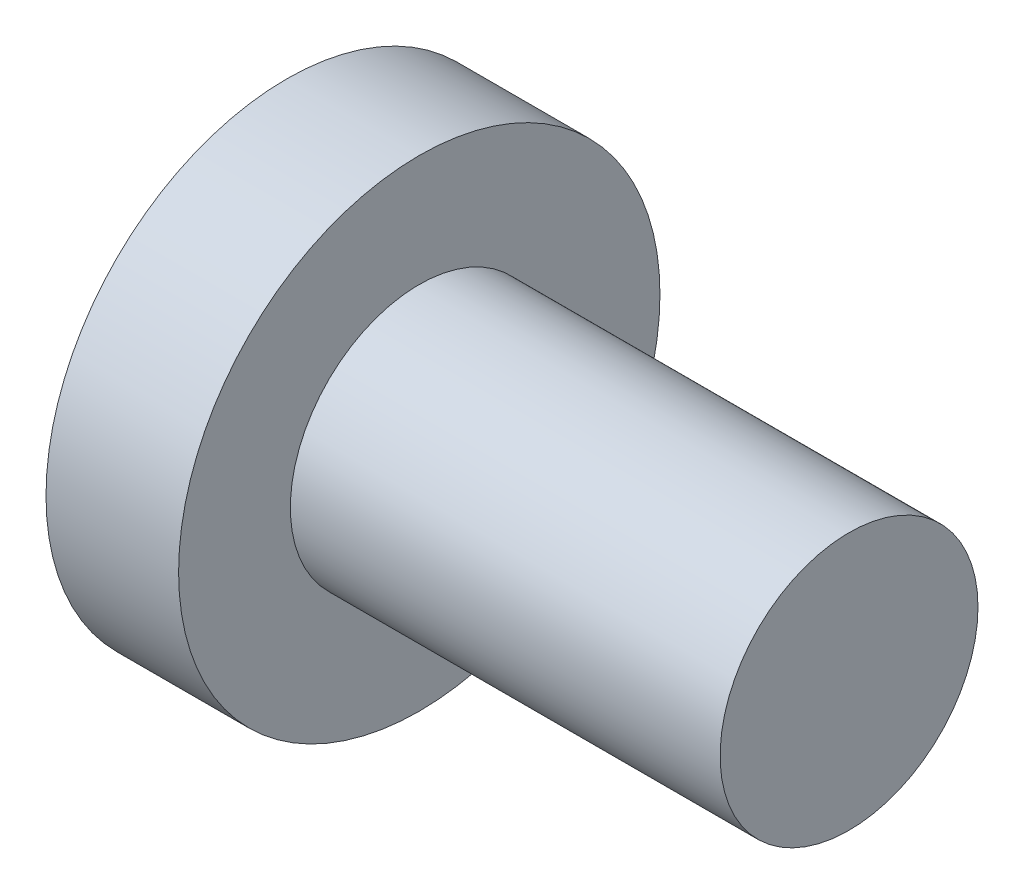
ISO-10303-21;
HEADER;
FILE_DESCRIPTION(('STEP AP214'),'2;1');
FILE_NAME('part.step','',(''),(''),'','','');
FILE_SCHEMA(('AUTOMOTIVE_DESIGN { 1 0 10303 214 1 1 1 1 }'));
ENDSEC;
DATA;
#1=APPLICATION_CONTEXT('core data for automotive mechanical design processes');
#2=APPLICATION_PROTOCOL_DEFINITION('international standard','automotive_design',2000,#1);
#3=PRODUCT_CONTEXT('',#1,'mechanical');
#4=PRODUCT('Part','Part','',(#3));
#5=PRODUCT_RELATED_PRODUCT_CATEGORY('part','',(#4));
#6=PRODUCT_DEFINITION_FORMATION('','',#4);
#7=PRODUCT_DEFINITION_CONTEXT('part definition',#1,'design');
#8=PRODUCT_DEFINITION('design','',#6,#7);
#9=PRODUCT_DEFINITION_SHAPE('','',#8);
#10=(LENGTH_UNIT() NAMED_UNIT(*) SI_UNIT(.MILLI.,.METRE.));
#11=(NAMED_UNIT(*) PLANE_ANGLE_UNIT() SI_UNIT($,.RADIAN.));
#12=(NAMED_UNIT(*) SI_UNIT($,.STERADIAN.) SOLID_ANGLE_UNIT());
#13=UNCERTAINTY_MEASURE_WITH_UNIT(LENGTH_MEASURE(1.E-05),#10,'distance_accuracy_value','');
#14=(GEOMETRIC_REPRESENTATION_CONTEXT(3) GLOBAL_UNCERTAINTY_ASSIGNED_CONTEXT((#13)) GLOBAL_UNIT_ASSIGNED_CONTEXT((#10,
#11,#12)) REPRESENTATION_CONTEXT('',''));
#15=CARTESIAN_POINT('',(0.,0.,0.));
#16=DIRECTION('',(0.,0.,1.));
#17=DIRECTION('',(1.,0.,0.));
#18=AXIS2_PLACEMENT_3D('',#15,#16,#17);
#19=CARTESIAN_POINT('',(1.68,0.3,0.3));
#20=DIRECTION('',(1.,0.,0.));
#21=DIRECTION('',(0.,0.,-1.));
#22=AXIS2_PLACEMENT_3D('',#19,#20,#21);
#23=PLANE('',#22);
#24=CARTESIAN_POINT('',(1.68,0.6,0.6));
#25=DIRECTION('',(-1.,0.,0.));
#26=DIRECTION('',(0.,0.,1.));
#27=AXIS2_PLACEMENT_3D('',#24,#25,#26);
#28=CIRCLE('',#27,0.3);
#29=CARTESIAN_POINT('',(1.68,0.530051547761426,0.308268592658542));
#30=VERTEX_POINT('',#29);
#31=CARTESIAN_POINT('',(1.68,0.308268592658542,0.530051547761425));
#32=VERTEX_POINT('',#31);
#33=EDGE_CURVE('E19',#30,#32,#28,.T.);
#34=ORIENTED_EDGE('',*,*,#33,.F.);
#35=DIRECTION('',(0.,0.,1.));
#36=VECTOR('',#35,1.);
#37=CARTESIAN_POINT('',(1.68,0.530051547761426,0.));
#38=LINE('',#37,#36);
#39=CARTESIAN_POINT('',(1.68,0.530051547761426,-0.308268592658542));
#40=VERTEX_POINT('',#39);
#41=EDGE_CURVE('E129',#40,#30,#38,.T.);
#42=ORIENTED_EDGE('',*,*,#41,.F.);
#43=CARTESIAN_POINT('',(1.68,0.6,-0.6));
#44=DIRECTION('',(-1.,0.,0.));
#45=DIRECTION('',(0.,0.,1.));
#46=AXIS2_PLACEMENT_3D('',#43,#44,#45);
#47=CIRCLE('',#46,0.3);
#48=CARTESIAN_POINT('',(1.68,0.308268592658542,-0.530051547761426));
#49=VERTEX_POINT('',#48);
#50=EDGE_CURVE('E270',#49,#40,#47,.T.);
#51=ORIENTED_EDGE('',*,*,#50,.F.);
#52=DIRECTION('',(0.,1.,0.));
#53=VECTOR('',#52,1.);
#54=CARTESIAN_POINT('',(1.68,0.,-0.530051547761426));
#55=LINE('',#54,#53);
#56=CARTESIAN_POINT('',(1.68,-0.308268592658542,-0.530051547761426));
#57=VERTEX_POINT('',#56);
#58=EDGE_CURVE('E152',#57,#49,#55,.T.);
#59=ORIENTED_EDGE('',*,*,#58,.F.);
#60=CARTESIAN_POINT('',(1.68,-0.6,-0.6));
#61=DIRECTION('',(-1.,0.,0.));
#62=DIRECTION('',(0.,0.,1.));
#63=AXIS2_PLACEMENT_3D('',#60,#61,#62);
#64=CIRCLE('',#63,0.3);
#65=CARTESIAN_POINT('',(1.68,-0.530051547761426,-0.308268592658542));
#66=VERTEX_POINT('',#65);
#67=EDGE_CURVE('E288',#66,#57,#64,.T.);
#68=ORIENTED_EDGE('',*,*,#67,.F.);
#69=DIRECTION('',(0.,0.,1.));
#70=VECTOR('',#69,1.);
#71=CARTESIAN_POINT('',(1.68,-0.530051547761426,0.));
#72=LINE('',#71,#70);
#73=CARTESIAN_POINT('',(1.68,-0.530051547761426,0.308268592658541));
#74=VERTEX_POINT('',#73);
#75=EDGE_CURVE('E157',#74,#66,#72,.F.);
#76=ORIENTED_EDGE('',*,*,#75,.F.);
#77=CARTESIAN_POINT('',(1.68,-0.6,0.6));
#78=DIRECTION('',(-1.,0.,0.));
#79=DIRECTION('',(0.,0.,1.));
#80=AXIS2_PLACEMENT_3D('',#77,#78,#79);
#81=CIRCLE('',#80,0.3);
#82=CARTESIAN_POINT('',(1.68,-0.308268592658542,0.530051547761425));
#83=VERTEX_POINT('',#82);
#84=EDGE_CURVE('E319',#83,#74,#81,.T.);
#85=ORIENTED_EDGE('',*,*,#84,.F.);
#86=DIRECTION('',(0.,1.,0.));
#87=VECTOR('',#86,1.);
#88=CARTESIAN_POINT('',(1.68,0.,0.530051547761425));
#89=LINE('',#88,#87);
#90=EDGE_CURVE('E132',#32,#83,#89,.F.);
#91=ORIENTED_EDGE('',*,*,#90,.F.);
#92=EDGE_LOOP('',(#34,#42,#51,#59,#68,#76,#85,#91));
#93=FACE_BOUND('',#92,.T.);
#94=ADVANCED_FACE('F16',(#93),#23,.F.);
#95=CARTESIAN_POINT('',(1.68,0.6,0.6));
#96=DIRECTION('',(-1.,0.,0.));
#97=DIRECTION('',(0.,0.,1.));
#98=AXIS2_PLACEMENT_3D('',#95,#96,#97);
#99=CYLINDRICAL_SURFACE('',#98,0.3);
#100=DIRECTION('',(1.,0.,0.));
#101=VECTOR('',#100,1.);
#102=CARTESIAN_POINT('',(1.68,0.6,0.3));
#103=LINE('',#102,#101);
#104=CARTESIAN_POINT('',(1.55884572681199,0.6,0.3));
#105=VERTEX_POINT('',#104);
#106=CARTESIAN_POINT('',(0.0452043432650023,0.6,0.3));
#107=VERTEX_POINT('',#106);
#108=EDGE_CURVE('E140',#105,#107,#103,.F.);
#109=ORIENTED_EDGE('',*,*,#108,.F.);
#110=CARTESIAN_POINT('',(1.55884572681199,0.6,0.6));
#111=DIRECTION('',(-0.500000000000001,-0.866025403784438,0.));
#112=DIRECTION('',(-0.866025403784438,0.500000000000001,0.));
#113=AXIS2_PLACEMENT_3D('',#110,#111,#112);
#114=ELLIPSE('',#113,0.599999999999999,0.3);
#115=EDGE_CURVE('E137',#30,#105,#114,.F.);
#116=ORIENTED_EDGE('',*,*,#115,.F.);
#117=ORIENTED_EDGE('',*,*,#33,.T.);
#118=CARTESIAN_POINT('',(1.55884572681198,0.6,0.6));
#119=DIRECTION('',(-0.500000000000001,0.,-0.866025403784438));
#120=DIRECTION('',(-0.866025403784438,0.,0.500000000000001));
#121=AXIS2_PLACEMENT_3D('',#118,#119,#120);
#122=ELLIPSE('',#121,0.599999999999999,0.3);
#123=CARTESIAN_POINT('',(1.55884572681198,0.3,0.6));
#124=VERTEX_POINT('',#123);
#125=EDGE_CURVE('E163',#124,#32,#122,.F.);
#126=ORIENTED_EDGE('',*,*,#125,.F.);
#127=DIRECTION('',(1.,0.,0.));
#128=VECTOR('',#127,1.);
#129=CARTESIAN_POINT('',(1.68,0.3,0.6));
#130=LINE('',#129,#128);
#131=CARTESIAN_POINT('',(0.0452043432650022,0.3,0.6));
#132=VERTEX_POINT('',#131);
#133=EDGE_CURVE('E342',#132,#124,#130,.T.);
#134=ORIENTED_EDGE('',*,*,#133,.F.);
#135=CARTESIAN_POINT('',(0.045204343265002,0.3,0.6));
#136=CARTESIAN_POINT('',(0.0431803773547012,0.299985307394552,0.583300670242799));
#137=CARTESIAN_POINT('',(0.041327518972927,0.301393620932924,0.566581321954255));
#138=CARTESIAN_POINT('',(0.0380100167582494,0.306971691490191,0.533576811460895));
#139=CARTESIAN_POINT('',(0.0365452234518665,0.311140383105357,0.517291484261665));
#140=CARTESIAN_POINT('',(0.0340472246762041,0.322159147202066,0.485603014109345));
#141=CARTESIAN_POINT('',(0.0330143640419723,0.329011353659084,0.470200584453282));
#142=CARTESIAN_POINT('',(0.0314127308771856,0.345205677002303,0.440745321476264));
#143=CARTESIAN_POINT('',(0.0308438058524891,0.354546974391774,0.42669204603377));
#144=CARTESIAN_POINT('',(0.030189505257813,0.375376386086933,0.400443408955856));
#145=CARTESIAN_POINT('',(0.0301004242477691,0.386847339617377,0.388234519849491));
#146=CARTESIAN_POINT('',(0.0303985250512259,0.411655423140221,0.365895579294851));
#147=CARTESIAN_POINT('',(0.0307856968896434,0.424992514041316,0.355765484311561));
#148=CARTESIAN_POINT('',(0.032022381055998,0.453099673774388,0.337899287994745));
#149=CARTESIAN_POINT('',(0.0328703456485037,0.467864810298885,0.330155307737354));
#150=CARTESIAN_POINT('',(0.0350026991839894,0.498444039106635,0.317225070540744));
#151=CARTESIAN_POINT('',(0.0362869301680749,0.514257750067229,0.31203788952542));
#152=CARTESIAN_POINT('',(0.0388210736951917,0.541786227489904,0.305467739618173));
#153=CARTESIAN_POINT('',(0.0399723668986842,0.553355696172929,0.303417159470297));
#154=CARTESIAN_POINT('',(0.0424563460152725,0.576618897289143,0.300683149392092));
#155=CARTESIAN_POINT('',(0.0437887695702878,0.588312427845028,0.299997764117682));
#156=CARTESIAN_POINT('',(0.0452043432650021,0.6,0.3));
#157=B_SPLINE_CURVE_WITH_KNOTS('',3,(#135,#136,#137,#138,#139,#140,#141,#142,#143,#144,#145,
#146,#147,#148,#149,#150,#151,#152,#153,#154,#155,#156),.UNSPECIFIED.,.F.,.F.,(4,2,2,2,2,2,2,2,
2,2,4),(0.,0.0504039946641535,0.100788546583136,0.15121324675653,0.201621365804848,
0.251639660452722,0.301656907488701,0.35150718308533,0.401339428604898,0.436680554237492,
0.471971024908162),.UNSPECIFIED.);
#158=EDGE_CURVE('E135',#132,#107,#157,.T.);
#159=ORIENTED_EDGE('',*,*,#158,.T.);
#160=EDGE_LOOP('',(#109,#116,#117,#126,#134,#159));
#161=FACE_BOUND('',#160,.T.);
#162=ADVANCED_FACE('F138',(#161),#99,.T.);
#163=CARTESIAN_POINT('',(0.,0.,1.5));
#164=DIRECTION('',(-0.500000000000001,0.,-0.866025403784438));
#165=DIRECTION('',(-0.866025403784438,0.,0.500000000000001));
#166=AXIS2_PLACEMENT_3D('',#163,#164,#165);
#167=PLANE('',#166);
#168=DIRECTION('',(0.866025403784438,0.,-0.500000000000001));
#169=VECTOR('',#168,1.);
#170=CARTESIAN_POINT('',(0.204192141108151,-0.3,1.3821096123648));
#171=LINE('',#170,#169);
#172=CARTESIAN_POINT('',(0.204192141108152,-0.300000000000001,1.3821096123648));
#173=VERTEX_POINT('',#172);
#174=CARTESIAN_POINT('',(1.55884572681198,-0.3,0.6));
#175=VERTEX_POINT('',#174);
#176=EDGE_CURVE('E351',#173,#175,#171,.T.);
#177=ORIENTED_EDGE('',*,*,#176,.F.);
#178=CARTESIAN_POINT('',(0.204192141108152,-0.3,1.3821096123648));
#179=CARTESIAN_POINT('',(0.198834163165734,-0.200000000000001,1.38520304237217));
#180=CARTESIAN_POINT('',(0.196155174194525,-0.100000000000001,1.38674975737585));
#181=CARTESIAN_POINT('',(0.196155174194525,0.0999999999999991,1.38674975737585));
#182=CARTESIAN_POINT('',(0.198834163165734,0.199999999999999,1.38520304237217));
#183=CARTESIAN_POINT('',(0.204192141108152,0.299999999999999,1.3821096123648));
#184=B_SPLINE_CURVE_WITH_KNOTS('',3,(#178,#179,#180,#181,#182,#183),.UNSPECIFIED.,.F.,.F.,(4,2,
4),(0.,0.300143505315198,0.600287010630396),.UNSPECIFIED.);
#185=CARTESIAN_POINT('',(0.204192141108152,0.299999999999999,1.3821096123648));
#186=VERTEX_POINT('',#185);
#187=EDGE_CURVE('E162',#173,#186,#184,.T.);
#188=ORIENTED_EDGE('',*,*,#187,.T.);
#189=DIRECTION('',(-0.866025403784438,0.,0.500000000000001));
#190=VECTOR('',#189,1.);
#191=CARTESIAN_POINT('',(1.55884572681198,0.3,0.6));
#192=LINE('',#191,#190);
#193=EDGE_CURVE('E340',#124,#186,#192,.T.);
#194=ORIENTED_EDGE('',*,*,#193,.F.);
#195=ORIENTED_EDGE('',*,*,#125,.T.);
#196=ORIENTED_EDGE('',*,*,#90,.T.);
#197=CARTESIAN_POINT('',(1.55884572681198,-0.6,0.6));
#198=DIRECTION('',(-0.500000000000001,0.,-0.866025403784438));
#199=DIRECTION('',(-0.866025403784438,0.,0.500000000000001));
#200=AXIS2_PLACEMENT_3D('',#197,#198,#199);
#201=ELLIPSE('',#200,0.599999999999999,0.3);
#202=EDGE_CURVE('E310',#175,#83,#201,.T.);
#203=ORIENTED_EDGE('',*,*,#202,.F.);
#204=EDGE_LOOP('',(#177,#188,#194,#195,#196,#203));
#205=FACE_BOUND('',#204,.T.);
#206=ADVANCED_FACE('F326',(#205),#167,.T.);
#207=CARTESIAN_POINT('',(1.68,-0.6,0.6));
#208=DIRECTION('',(-1.,0.,0.));
#209=DIRECTION('',(0.,0.,1.));
#210=AXIS2_PLACEMENT_3D('',#207,#208,#209);
#211=CYLINDRICAL_SURFACE('',#210,0.3);
#212=DIRECTION('',(1.,0.,0.));
#213=VECTOR('',#212,1.);
#214=CARTESIAN_POINT('',(1.68,-0.3,0.6));
#215=LINE('',#214,#213);
#216=CARTESIAN_POINT('',(0.0452043432650022,-0.300000000000001,0.6));
#217=VERTEX_POINT('',#216);
#218=EDGE_CURVE('E354',#175,#217,#215,.F.);
#219=ORIENTED_EDGE('',*,*,#218,.F.);
#220=ORIENTED_EDGE('',*,*,#202,.T.);
#221=ORIENTED_EDGE('',*,*,#84,.T.);
#222=CARTESIAN_POINT('',(1.55884572681199,-0.6,0.6));
#223=DIRECTION('',(-0.500000000000001,0.866025403784438,0.));
#224=DIRECTION('',(-0.866025403784438,-0.500000000000001,0.));
#225=AXIS2_PLACEMENT_3D('',#222,#223,#224);
#226=ELLIPSE('',#225,0.599999999999999,0.3);
#227=CARTESIAN_POINT('',(1.55884572681199,-0.6,0.3));
#228=VERTEX_POINT('',#227);
#229=EDGE_CURVE('E161',#228,#74,#226,.F.);
#230=ORIENTED_EDGE('',*,*,#229,.F.);
#231=DIRECTION('',(1.,0.,0.));
#232=VECTOR('',#231,1.);
#233=CARTESIAN_POINT('',(1.68,-0.6,0.3));
#234=LINE('',#233,#232);
#235=CARTESIAN_POINT('',(0.0452043432650023,-0.6,0.3));
#236=VERTEX_POINT('',#235);
#237=EDGE_CURVE('E357',#236,#228,#234,.T.);
#238=ORIENTED_EDGE('',*,*,#237,.F.);
#239=CARTESIAN_POINT('',(0.0452043432650021,-0.6,0.3));
#240=CARTESIAN_POINT('',(0.0431803773547016,-0.583300670242799,0.299985307394551));
#241=CARTESIAN_POINT('',(0.0413275189729278,-0.566581321954256,0.301393620932923));
#242=CARTESIAN_POINT('',(0.0380100167582504,-0.533576811460895,0.306971691490192));
#243=CARTESIAN_POINT('',(0.0365452234518675,-0.517291484261665,0.311140383105358));
#244=CARTESIAN_POINT('',(0.0340472246762045,-0.485603014109344,0.322159147202067));
#245=CARTESIAN_POINT('',(0.0330143640419721,-0.470200584453281,0.329011353659085));
#246=CARTESIAN_POINT('',(0.0314127308771858,-0.440745321476262,0.345205677002304));
#247=CARTESIAN_POINT('',(0.0308438058524903,-0.426692046033767,0.354546974391775));
#248=CARTESIAN_POINT('',(0.0301895052578136,-0.400443408955854,0.375376386086934));
#249=CARTESIAN_POINT('',(0.0301004242477683,-0.388234519849489,0.386847339617379));
#250=CARTESIAN_POINT('',(0.0303985250512248,-0.36589557929485,0.411655423140223));
#251=CARTESIAN_POINT('',(0.0307856968896435,-0.35576548431156,0.424992514041319));
#252=CARTESIAN_POINT('',(0.0320223810559983,-0.337899287994744,0.453099673774391));
#253=CARTESIAN_POINT('',(0.032870345648503,-0.330155307737353,0.467864810298888));
#254=CARTESIAN_POINT('',(0.0350026991839885,-0.317225070540742,0.498444039106638));
#255=CARTESIAN_POINT('',(0.0362869301680749,-0.312037889525418,0.514257750067232));
#256=CARTESIAN_POINT('',(0.038821073695192,-0.305467739618172,0.541786227489906));
#257=CARTESIAN_POINT('',(0.0399723668986844,-0.303417159470297,0.553355696172931));
#258=CARTESIAN_POINT('',(0.0424563460152723,-0.300683149392093,0.576618897289144));
#259=CARTESIAN_POINT('',(0.0437887695702875,-0.299997764117683,0.588312427845028));
#260=CARTESIAN_POINT('',(0.045204343265002,-0.300000000000001,0.6));
#261=B_SPLINE_CURVE_WITH_KNOTS('',3,(#239,#240,#241,#242,#243,#244,#245,#246,#247,#248,#249,
#250,#251,#252,#253,#254,#255,#256,#257,#258,#259,#260),.UNSPECIFIED.,.F.,.F.,(4,2,2,2,2,2,2,2,
2,2,4),(0.,0.0504039946641538,0.100788546583137,0.151213246756532,0.201621365804851,
0.251639660452725,0.301656907488704,0.351507183085334,0.401339428604901,0.436680554237494,
0.471971024908162),.UNSPECIFIED.);
#262=EDGE_CURVE('E313',#236,#217,#261,.T.);
#263=ORIENTED_EDGE('',*,*,#262,.T.);
#264=EDGE_LOOP('',(#219,#220,#221,#230,#238,#263));
#265=FACE_BOUND('',#264,.T.);
#266=ADVANCED_FACE('F299',(#265),#211,.T.);
#267=CARTESIAN_POINT('',(0.,-1.5,0.));
#268=DIRECTION('',(-0.500000000000001,0.866025403784438,0.));
#269=DIRECTION('',(-0.866025403784438,-0.500000000000001,0.));
#270=AXIS2_PLACEMENT_3D('',#267,#268,#269);
#271=PLANE('',#270);
#272=DIRECTION('',(0.866025403784438,0.500000000000001,0.));
#273=VECTOR('',#272,1.);
#274=CARTESIAN_POINT('',(0.204192141108152,-1.3821096123648,-0.3));
#275=LINE('',#274,#273);
#276=CARTESIAN_POINT('',(0.204192141108152,-1.3821096123648,-0.300000000000001));
#277=VERTEX_POINT('',#276);
#278=CARTESIAN_POINT('',(1.55884572681199,-0.6,-0.3));
#279=VERTEX_POINT('',#278);
#280=EDGE_CURVE('E363',#277,#279,#275,.T.);
#281=ORIENTED_EDGE('',*,*,#280,.F.);
#282=CARTESIAN_POINT('',(0.204192141108152,-1.3821096123648,-0.300000000000002));
#283=CARTESIAN_POINT('',(0.198834163165734,-1.38520304237217,-0.200000000000001));
#284=CARTESIAN_POINT('',(0.196155174194526,-1.38674975737585,-0.100000000000001));
#285=CARTESIAN_POINT('',(0.196155174194528,-1.38674975737585,0.1));
#286=CARTESIAN_POINT('',(0.198834163165739,-1.38520304237218,0.2));
#287=CARTESIAN_POINT('',(0.204192141108159,-1.38210961236482,0.300000000000001));
#288=B_SPLINE_CURVE_WITH_KNOTS('',3,(#282,#283,#284,#285,#286,#287),.UNSPECIFIED.,.F.,.F.,(4,2,
4),(0.,0.3001435053152,0.600287010630398),.UNSPECIFIED.);
#289=CARTESIAN_POINT('',(0.204192141108152,-1.3821096123648,0.299999999999999));
#290=VERTEX_POINT('',#289);
#291=EDGE_CURVE('E160',#277,#290,#288,.T.);
#292=ORIENTED_EDGE('',*,*,#291,.T.);
#293=DIRECTION('',(-0.866025403784438,-0.500000000000001,0.));
#294=VECTOR('',#293,1.);
#295=CARTESIAN_POINT('',(1.55884572681199,-0.6,0.3));
#296=LINE('',#295,#294);
#297=EDGE_CURVE('E360',#228,#290,#296,.T.);
#298=ORIENTED_EDGE('',*,*,#297,.F.);
#299=ORIENTED_EDGE('',*,*,#229,.T.);
#300=ORIENTED_EDGE('',*,*,#75,.T.);
#301=CARTESIAN_POINT('',(1.55884572681199,-0.6,-0.6));
#302=DIRECTION('',(-0.500000000000001,0.866025403784438,0.));
#303=DIRECTION('',(-0.866025403784438,-0.500000000000001,0.));
#304=AXIS2_PLACEMENT_3D('',#301,#302,#303);
#305=ELLIPSE('',#304,0.599999999999999,0.3);
#306=EDGE_CURVE('E279',#279,#66,#305,.T.);
#307=ORIENTED_EDGE('',*,*,#306,.F.);
#308=EDGE_LOOP('',(#281,#292,#298,#299,#300,#307));
#309=FACE_BOUND('',#308,.T.);
#310=ADVANCED_FACE('F294',(#309),#271,.T.);
#311=CARTESIAN_POINT('',(1.68,-0.6,-0.6));
#312=DIRECTION('',(-1.,0.,0.));
#313=DIRECTION('',(0.,0.,1.));
#314=AXIS2_PLACEMENT_3D('',#311,#312,#313);
#315=CYLINDRICAL_SURFACE('',#314,0.3);
#316=DIRECTION('',(1.,0.,0.));
#317=VECTOR('',#316,1.);
#318=CARTESIAN_POINT('',(1.68,-0.6,-0.3));
#319=LINE('',#318,#317);
#320=CARTESIAN_POINT('',(0.0452043432650023,-0.6,-0.300000000000001));
#321=VERTEX_POINT('',#320);
#322=EDGE_CURVE('E366',#279,#321,#319,.F.);
#323=ORIENTED_EDGE('',*,*,#322,.F.);
#324=ORIENTED_EDGE('',*,*,#306,.T.);
#325=ORIENTED_EDGE('',*,*,#67,.T.);
#326=CARTESIAN_POINT('',(1.55884572681198,-0.6,-0.6));
#327=DIRECTION('',(-0.500000000000001,0.,0.866025403784438));
#328=DIRECTION('',(-0.866025403784438,0.,-0.500000000000001));
#329=AXIS2_PLACEMENT_3D('',#326,#327,#328);
#330=ELLIPSE('',#329,0.599999999999999,0.3);
#331=CARTESIAN_POINT('',(1.55884572681198,-0.3,-0.6));
#332=VERTEX_POINT('',#331);
#333=EDGE_CURVE('E156',#332,#57,#330,.F.);
#334=ORIENTED_EDGE('',*,*,#333,.F.);
#335=DIRECTION('',(1.,0.,0.));
#336=VECTOR('',#335,1.);
#337=CARTESIAN_POINT('',(1.68,-0.3,-0.6));
#338=LINE('',#337,#336);
#339=CARTESIAN_POINT('',(0.0452043432650025,-0.299999999999999,-0.6));
#340=VERTEX_POINT('',#339);
#341=EDGE_CURVE('E369',#340,#332,#338,.T.);
#342=ORIENTED_EDGE('',*,*,#341,.F.);
#343=CARTESIAN_POINT('',(0.0452043432650026,-0.299999999999999,-0.6));
#344=CARTESIAN_POINT('',(0.0431803773547003,-0.29998530739455,-0.583300670242799));
#345=CARTESIAN_POINT('',(0.0413275189729264,-0.301393620932923,-0.566581321954256));
#346=CARTESIAN_POINT('',(0.03801001675825,-0.306971691490192,-0.533576811460897));
#347=CARTESIAN_POINT('',(0.036545223451868,-0.311140383105358,-0.517291484261668));
#348=CARTESIAN_POINT('',(0.0340472246762054,-0.322159147202067,-0.485603014109347));
#349=CARTESIAN_POINT('',(0.0330143640419726,-0.329011353659083,-0.470200584453284));
#350=CARTESIAN_POINT('',(0.0314127308771854,-0.345205677002302,-0.440745321476266));
#351=CARTESIAN_POINT('',(0.0308438058524896,-0.354546974391772,-0.426692046033773));
#352=CARTESIAN_POINT('',(0.0301895052578136,-0.375376386086932,-0.400443408955859));
#353=CARTESIAN_POINT('',(0.0301004242477691,-0.386847339617376,-0.388234519849494));
#354=CARTESIAN_POINT('',(0.0303985250512255,-0.411655423140219,-0.365895579294853));
#355=CARTESIAN_POINT('',(0.0307856968896433,-0.424992514041314,-0.355765484311563));
#356=CARTESIAN_POINT('',(0.0320223810559981,-0.453099673774386,-0.337899287994746));
#357=CARTESIAN_POINT('',(0.0328703456485038,-0.467864810298883,-0.330155307737354));
#358=CARTESIAN_POINT('',(0.0350026991839894,-0.498444039106633,-0.317225070540745));
#359=CARTESIAN_POINT('',(0.0362869301680749,-0.514257750067228,-0.312037889525424));
#360=CARTESIAN_POINT('',(0.0388210736951917,-0.541786227489903,-0.305467739618176));
#361=CARTESIAN_POINT('',(0.0399723668986842,-0.553355696172928,-0.303417159470298));
#362=CARTESIAN_POINT('',(0.0424563460152725,-0.576618897289142,-0.300683149392092));
#363=CARTESIAN_POINT('',(0.0437887695702878,-0.588312427845028,-0.299997764117681));
#364=CARTESIAN_POINT('',(0.0452043432650021,-0.6,-0.300000000000003));
#365=B_SPLINE_CURVE_WITH_KNOTS('',3,(#343,#344,#345,#346,#347,#348,#349,#350,#351,#352,#353,
#354,#355,#356,#357,#358,#359,#360,#361,#362,#363,#364),.UNSPECIFIED.,.F.,.F.,(4,2,2,2,2,2,2,2,
2,2,4),(0.,0.0504039946641526,0.100788546583134,0.151213246756527,0.201621365804845,
0.251639660452719,0.301656907488699,0.351507183085328,0.401339428604895,0.436680554237491,
0.471971024908162),.UNSPECIFIED.);
#366=EDGE_CURVE('E282',#340,#321,#365,.T.);
#367=ORIENTED_EDGE('',*,*,#366,.T.);
#368=EDGE_LOOP('',(#323,#324,#325,#334,#342,#367));
#369=FACE_BOUND('',#368,.T.);
#370=ADVANCED_FACE('F290',(#369),#315,.T.);
#371=CARTESIAN_POINT('',(0.,0.,-1.5));
#372=DIRECTION('',(-0.500000000000001,0.,0.866025403784438));
#373=DIRECTION('',(0.866025403784438,0.,0.500000000000001));
#374=AXIS2_PLACEMENT_3D('',#371,#372,#373);
#375=PLANE('',#374);
#376=DIRECTION('',(0.866025403784438,0.,0.500000000000001));
#377=VECTOR('',#376,1.);
#378=CARTESIAN_POINT('',(0.204192141108152,0.3,-1.3821096123648));
#379=LINE('',#378,#377);
#380=CARTESIAN_POINT('',(0.204192141108152,0.3,-1.3821096123648));
#381=VERTEX_POINT('',#380);
#382=CARTESIAN_POINT('',(1.55884572681198,0.3,-0.6));
#383=VERTEX_POINT('',#382);
#384=EDGE_CURVE('E375',#381,#383,#379,.T.);
#385=ORIENTED_EDGE('',*,*,#384,.F.);
#386=CARTESIAN_POINT('',(0.204192141108152,0.3,-1.3821096123648));
#387=CARTESIAN_POINT('',(0.198834163165734,0.2,-1.38520304237217));
#388=CARTESIAN_POINT('',(0.196155174194526,0.0999999999999999,-1.38674975737585));
#389=CARTESIAN_POINT('',(0.196155174194526,-0.1,-1.38674975737585));
#390=CARTESIAN_POINT('',(0.198834163165734,-0.2,-1.38520304237217));
#391=CARTESIAN_POINT('',(0.204192141108152,-0.3,-1.3821096123648));
#392=B_SPLINE_CURVE_WITH_KNOTS('',3,(#386,#387,#388,#389,#390,#391),.UNSPECIFIED.,.F.,.F.,(4,2,
4),(0.,0.300143505315198,0.600287010630397),.UNSPECIFIED.);
#393=CARTESIAN_POINT('',(0.204192141108152,-0.3,-1.3821096123648));
#394=VERTEX_POINT('',#393);
#395=EDGE_CURVE('E155',#381,#394,#392,.T.);
#396=ORIENTED_EDGE('',*,*,#395,.T.);
#397=DIRECTION('',(-0.866025403784438,0.,-0.500000000000001));
#398=VECTOR('',#397,1.);
#399=CARTESIAN_POINT('',(1.55884572681198,-0.3,-0.6));
#400=LINE('',#399,#398);
#401=EDGE_CURVE('E372',#332,#394,#400,.T.);
#402=ORIENTED_EDGE('',*,*,#401,.F.);
#403=ORIENTED_EDGE('',*,*,#333,.T.);
#404=ORIENTED_EDGE('',*,*,#58,.T.);
#405=CARTESIAN_POINT('',(1.55884572681198,0.6,-0.6));
#406=DIRECTION('',(-0.500000000000001,0.,0.866025403784438));
#407=DIRECTION('',(-0.866025403784438,0.,-0.500000000000001));
#408=AXIS2_PLACEMENT_3D('',#405,#406,#407);
#409=ELLIPSE('',#408,0.599999999999999,0.3);
#410=EDGE_CURVE('E146',#383,#49,#409,.T.);
#411=ORIENTED_EDGE('',*,*,#410,.F.);
#412=EDGE_LOOP('',(#385,#396,#402,#403,#404,#411));
#413=FACE_BOUND('',#412,.T.);
#414=ADVANCED_FACE('F258',(#413),#375,.T.);
#415=CARTESIAN_POINT('',(1.68,0.6,-0.6));
#416=DIRECTION('',(-1.,0.,0.));
#417=DIRECTION('',(0.,0.,1.));
#418=AXIS2_PLACEMENT_3D('',#415,#416,#417);
#419=CYLINDRICAL_SURFACE('',#418,0.3);
#420=DIRECTION('',(1.,0.,0.));
#421=VECTOR('',#420,1.);
#422=CARTESIAN_POINT('',(1.68,0.3,-0.6));
#423=LINE('',#422,#421);
#424=CARTESIAN_POINT('',(0.0452043432650025,0.3,-0.6));
#425=VERTEX_POINT('',#424);
#426=EDGE_CURVE('E378',#383,#425,#423,.F.);
#427=ORIENTED_EDGE('',*,*,#426,.F.);
#428=ORIENTED_EDGE('',*,*,#410,.T.);
#429=ORIENTED_EDGE('',*,*,#50,.T.);
#430=CARTESIAN_POINT('',(1.55884572681199,0.6,-0.6));
#431=DIRECTION('',(-0.500000000000001,-0.866025403784438,0.));
#432=DIRECTION('',(-0.866025403784438,0.500000000000001,0.));
#433=AXIS2_PLACEMENT_3D('',#430,#431,#432);
#434=ELLIPSE('',#433,0.599999999999999,0.3);
#435=CARTESIAN_POINT('',(1.55884572681199,0.6,-0.3));
#436=VERTEX_POINT('',#435);
#437=EDGE_CURVE('E144',#436,#40,#434,.F.);
#438=ORIENTED_EDGE('',*,*,#437,.F.);
#439=DIRECTION('',(1.,0.,0.));
#440=VECTOR('',#439,1.);
#441=CARTESIAN_POINT('',(1.68,0.6,-0.3));
#442=LINE('',#441,#440);
#443=CARTESIAN_POINT('',(0.0452043432650023,0.6,-0.300000000000001));
#444=VERTEX_POINT('',#443);
#445=EDGE_CURVE('E381',#444,#436,#442,.T.);
#446=ORIENTED_EDGE('',*,*,#445,.F.);
#447=CARTESIAN_POINT('',(0.0452043432650021,0.6,-0.300000000000002));
#448=CARTESIAN_POINT('',(0.0431803773547017,0.583300670242798,-0.299985307394552));
#449=CARTESIAN_POINT('',(0.0413275189729278,0.566581321954255,-0.301393620932924));
#450=CARTESIAN_POINT('',(0.0380100167582504,0.533576811460895,-0.306971691490192));
#451=CARTESIAN_POINT('',(0.0365452234518674,0.517291484261665,-0.311140383105358));
#452=CARTESIAN_POINT('',(0.0340472246762045,0.485603014109344,-0.322159147202067));
#453=CARTESIAN_POINT('',(0.0330143640419721,0.470200584453281,-0.329011353659085));
#454=CARTESIAN_POINT('',(0.0314127308771857,0.440745321476262,-0.345205677002304));
#455=CARTESIAN_POINT('',(0.0308438058524901,0.426692046033768,-0.354546974391775));
#456=CARTESIAN_POINT('',(0.0301895052578138,0.400443408955854,-0.375376386086934));
#457=CARTESIAN_POINT('',(0.0301004242477691,0.388234519849489,-0.386847339617379));
#458=CARTESIAN_POINT('',(0.0303985250512254,0.36589557929485,-0.411655423140224));
#459=CARTESIAN_POINT('',(0.0307856968896435,0.355765484311561,-0.424992514041321));
#460=CARTESIAN_POINT('',(0.0320223810559983,0.337899287994745,-0.453099673774393));
#461=CARTESIAN_POINT('',(0.0328703456485038,0.330155307737352,-0.46786481029889));
#462=CARTESIAN_POINT('',(0.0350026991839894,0.317225070540742,-0.498444039106639));
#463=CARTESIAN_POINT('',(0.0362869301680751,0.31203788952542,-0.514257750067233));
#464=CARTESIAN_POINT('',(0.0388210736951919,0.305467739618174,-0.541786227489908));
#465=CARTESIAN_POINT('',(0.0399723668986843,0.303417159470297,-0.553355696172932));
#466=CARTESIAN_POINT('',(0.0424563460152724,0.300683149392091,-0.576618897289144));
#467=CARTESIAN_POINT('',(0.0437887695702878,0.299997764117681,-0.588312427845029));
#468=CARTESIAN_POINT('',(0.0452043432650026,0.3,-0.6));
#469=B_SPLINE_CURVE_WITH_KNOTS('',3,(#447,#448,#449,#450,#451,#452,#453,#454,#455,#456,#457,
#458,#459,#460,#461,#462,#463,#464,#465,#466,#467,#468),.UNSPECIFIED.,.F.,.F.,(4,2,2,2,2,2,2,2,
2,2,4),(0.,0.0504039946641538,0.100788546583137,0.151213246756531,0.20162136580485,
0.251639660452724,0.301656907488706,0.351507183085334,0.401339428604901,0.436680554237494,
0.471971024908161),.UNSPECIFIED.);
#470=EDGE_CURVE('E263',#444,#425,#469,.T.);
#471=ORIENTED_EDGE('',*,*,#470,.T.);
#472=EDGE_LOOP('',(#427,#428,#429,#438,#446,#471));
#473=FACE_BOUND('',#472,.T.);
#474=ADVANCED_FACE('F254',(#473),#419,.T.);
#475=CARTESIAN_POINT('',(0.,1.5,0.));
#476=DIRECTION('',(-0.500000000000001,-0.866025403784438,0.));
#477=DIRECTION('',(0.866025403784438,-0.500000000000001,0.));
#478=AXIS2_PLACEMENT_3D('',#475,#476,#477);
#479=PLANE('',#478);
#480=DIRECTION('',(0.866025403784438,-0.500000000000001,0.));
#481=VECTOR('',#480,1.);
#482=CARTESIAN_POINT('',(0.204192141108152,1.3821096123648,0.3));
#483=LINE('',#482,#481);
#484=CARTESIAN_POINT('',(0.204192141108152,1.3821096123648,0.3));
#485=VERTEX_POINT('',#484);
#486=EDGE_CURVE('E150',#485,#105,#483,.T.);
#487=ORIENTED_EDGE('',*,*,#486,.F.);
#488=CARTESIAN_POINT('',(0.204192141108152,1.3821096123648,0.3));
#489=CARTESIAN_POINT('',(0.198834163165734,1.38520304237217,0.2));
#490=CARTESIAN_POINT('',(0.196155174194526,1.38674975737585,0.1));
#491=CARTESIAN_POINT('',(0.196155174194528,1.38674975737586,-0.1));
#492=CARTESIAN_POINT('',(0.198834163165739,1.38520304237218,-0.200000000000001));
#493=CARTESIAN_POINT('',(0.204192141108159,1.38210961236482,-0.300000000000001));
#494=B_SPLINE_CURVE_WITH_KNOTS('',3,(#488,#489,#490,#491,#492,#493),.UNSPECIFIED.,.F.,.F.,(4,2,
4),(0.,0.300143505315198,0.600287010630397),.UNSPECIFIED.);
#495=CARTESIAN_POINT('',(0.204192141108152,1.3821096123648,-0.300000000000001));
#496=VERTEX_POINT('',#495);
#497=EDGE_CURVE('E34',#485,#496,#494,.T.);
#498=ORIENTED_EDGE('',*,*,#497,.T.);
#499=DIRECTION('',(-0.866025403784438,0.500000000000001,0.));
#500=VECTOR('',#499,1.);
#501=CARTESIAN_POINT('',(1.55884572681199,0.6,-0.3));
#502=LINE('',#501,#500);
#503=EDGE_CURVE('E239',#436,#496,#502,.T.);
#504=ORIENTED_EDGE('',*,*,#503,.F.);
#505=ORIENTED_EDGE('',*,*,#437,.T.);
#506=ORIENTED_EDGE('',*,*,#41,.T.);
#507=ORIENTED_EDGE('',*,*,#115,.T.);
#508=EDGE_LOOP('',(#487,#498,#504,#505,#506,#507));
#509=FACE_BOUND('',#508,.T.);
#510=ADVANCED_FACE('F143',(#509),#479,.T.);
#511=CARTESIAN_POINT('',(1.68,0.3,0.3));
#512=DIRECTION('',(0.,0.,-1.));
#513=DIRECTION('',(0.,1.,0.));
#514=AXIS2_PLACEMENT_3D('',#511,#512,#513);
#515=PLANE('',#514);
#516=ORIENTED_EDGE('',*,*,#108,.T.);
#517=CARTESIAN_POINT('',(0.204192141108152,1.3821096123648,0.3));
#518=CARTESIAN_POINT('',(0.167255253335869,1.25388004167832,0.300000000000001));
#519=CARTESIAN_POINT('',(0.135537826296132,1.12458945530468,0.300000000000001));
#520=CARTESIAN_POINT('',(0.0825418936817485,0.863886251183081,0.299999999999999));
#521=CARTESIAN_POINT('',(0.0612633881071026,0.732473633435124,0.299999999999997));
#522=CARTESIAN_POINT('',(0.0452043432650024,0.600000000000009,0.299999999999993));
#523=B_SPLINE_CURVE_WITH_KNOTS('',3,(#517,#518,#519,#520,#521,#522),.UNSPECIFIED.,.F.,.F.,(4,2,
4),(0.,0.399372580588288,0.798745161176575),.UNSPECIFIED.);
#524=EDGE_CURVE('E231',#485,#107,#523,.T.);
#525=ORIENTED_EDGE('',*,*,#524,.F.);
#526=ORIENTED_EDGE('',*,*,#486,.T.);
#527=EDGE_LOOP('',(#516,#525,#526));
#528=FACE_BOUND('',#527,.T.);
#529=ADVANCED_FACE('F245',(#528),#515,.T.);
#530=CARTESIAN_POINT('',(1.68,0.3,0.3));
#531=DIRECTION('',(0.,-1.,0.));
#532=DIRECTION('',(0.,0.,-1.));
#533=AXIS2_PLACEMENT_3D('',#530,#531,#532);
#534=PLANE('',#533);
#535=ORIENTED_EDGE('',*,*,#133,.T.);
#536=ORIENTED_EDGE('',*,*,#193,.T.);
#537=CARTESIAN_POINT('',(5.,0.3,0.));
#538=DIRECTION('',(0.,1.,0.));
#539=DIRECTION('',(0.,0.,1.));
#540=AXIS2_PLACEMENT_3D('',#537,#538,#539);
#541=CIRCLE('',#540,4.99099188538711);
#542=EDGE_CURVE('E228',#132,#186,#541,.T.);
#543=ORIENTED_EDGE('',*,*,#542,.F.);
#544=EDGE_LOOP('',(#535,#536,#543));
#545=FACE_BOUND('',#544,.T.);
#546=ADVANCED_FACE('F249',(#545),#534,.T.);
#547=CARTESIAN_POINT('',(1.68,-0.3,0.3));
#548=DIRECTION('',(0.,1.,0.));
#549=DIRECTION('',(0.,0.,1.));
#550=AXIS2_PLACEMENT_3D('',#547,#548,#549);
#551=PLANE('',#550);
#552=ORIENTED_EDGE('',*,*,#218,.T.);
#553=CARTESIAN_POINT('',(5.,-0.3,0.));
#554=DIRECTION('',(0.,1.,0.));
#555=DIRECTION('',(0.,0.,1.));
#556=AXIS2_PLACEMENT_3D('',#553,#554,#555);
#557=CIRCLE('',#556,4.99099188538711);
#558=EDGE_CURVE('E225',#173,#217,#557,.F.);
#559=ORIENTED_EDGE('',*,*,#558,.F.);
#560=ORIENTED_EDGE('',*,*,#176,.T.);
#561=EDGE_LOOP('',(#552,#559,#560));
#562=FACE_BOUND('',#561,.T.);
#563=ADVANCED_FACE('F407',(#562),#551,.T.);
#564=CARTESIAN_POINT('',(1.68,-0.3,0.3));
#565=DIRECTION('',(0.,0.,-1.));
#566=DIRECTION('',(0.,1.,0.));
#567=AXIS2_PLACEMENT_3D('',#564,#565,#566);
#568=PLANE('',#567);
#569=ORIENTED_EDGE('',*,*,#237,.T.);
#570=ORIENTED_EDGE('',*,*,#297,.T.);
#571=CARTESIAN_POINT('',(0.0452043432650021,-0.6,0.3));
#572=CARTESIAN_POINT('',(0.0612633881071025,-0.732473633435119,0.3));
#573=CARTESIAN_POINT('',(0.0825418936817487,-0.863886251183079,0.3));
#574=CARTESIAN_POINT('',(0.135537826296133,-1.12458945530468,0.299999999999999));
#575=CARTESIAN_POINT('',(0.167255253335871,-1.25388004167833,0.299999999999997));
#576=CARTESIAN_POINT('',(0.204192141108155,-1.38210961236481,0.299999999999995));
#577=B_SPLINE_CURVE_WITH_KNOTS('',3,(#571,#572,#573,#574,#575,#576),.UNSPECIFIED.,.F.,.F.,(4,2,
4),(0.,0.399372580588297,0.798745161176594),.UNSPECIFIED.);
#578=EDGE_CURVE('E218',#236,#290,#577,.T.);
#579=ORIENTED_EDGE('',*,*,#578,.F.);
#580=EDGE_LOOP('',(#569,#570,#579));
#581=FACE_BOUND('',#580,.T.);
#582=ADVANCED_FACE('F205',(#581),#568,.T.);
#583=CARTESIAN_POINT('',(1.68,-0.3,-0.3));
#584=DIRECTION('',(0.,0.,1.));
#585=DIRECTION('',(1.,0.,0.));
#586=AXIS2_PLACEMENT_3D('',#583,#584,#585);
#587=PLANE('',#586);
#588=ORIENTED_EDGE('',*,*,#322,.T.);
#589=CARTESIAN_POINT('',(0.204192141108152,-1.3821096123648,-0.300000000000002));
#590=CARTESIAN_POINT('',(0.167255253335869,-1.25388004167832,-0.300000000000003));
#591=CARTESIAN_POINT('',(0.135537826296132,-1.12458945530468,-0.300000000000002));
#592=CARTESIAN_POINT('',(0.0825418936817485,-0.863886251183081,-0.299999999999999));
#593=CARTESIAN_POINT('',(0.0612633881071026,-0.732473633435124,-0.299999999999996));
#594=CARTESIAN_POINT('',(0.0452043432650024,-0.600000000000009,-0.299999999999993));
#595=B_SPLINE_CURVE_WITH_KNOTS('',3,(#589,#590,#591,#592,#593,#594),.UNSPECIFIED.,.F.,.F.,(4,2,
4),(0.,0.399372580588287,0.798745161176574),.UNSPECIFIED.);
#596=EDGE_CURVE('E210',#277,#321,#595,.T.);
#597=ORIENTED_EDGE('',*,*,#596,.F.);
#598=ORIENTED_EDGE('',*,*,#280,.T.);
#599=EDGE_LOOP('',(#588,#597,#598));
#600=FACE_BOUND('',#599,.T.);
#601=ADVANCED_FACE('F200',(#600),#587,.T.);
#602=CARTESIAN_POINT('',(1.68,-0.3,-0.3));
#603=DIRECTION('',(0.,1.,0.));
#604=DIRECTION('',(0.,0.,1.));
#605=AXIS2_PLACEMENT_3D('',#602,#603,#604);
#606=PLANE('',#605);
#607=ORIENTED_EDGE('',*,*,#341,.T.);
#608=ORIENTED_EDGE('',*,*,#401,.T.);
#609=CARTESIAN_POINT('',(5.,-0.299999999999999,0.));
#610=DIRECTION('',(0.,1.,0.));
#611=DIRECTION('',(0.,0.,1.));
#612=AXIS2_PLACEMENT_3D('',#609,#610,#611);
#613=CIRCLE('',#612,4.99099188538711);
#614=EDGE_CURVE('E217',#340,#394,#613,.F.);
#615=ORIENTED_EDGE('',*,*,#614,.F.);
#616=EDGE_LOOP('',(#607,#608,#615));
#617=FACE_BOUND('',#616,.T.);
#618=ADVANCED_FACE('F196',(#617),#606,.T.);
#619=CARTESIAN_POINT('',(1.68,0.3,-0.3));
#620=DIRECTION('',(0.,-1.,0.));
#621=DIRECTION('',(0.,0.,-1.));
#622=AXIS2_PLACEMENT_3D('',#619,#620,#621);
#623=PLANE('',#622);
#624=ORIENTED_EDGE('',*,*,#426,.T.);
#625=CARTESIAN_POINT('',(5.,0.3,0.));
#626=DIRECTION('',(0.,1.,0.));
#627=DIRECTION('',(0.,0.,1.));
#628=AXIS2_PLACEMENT_3D('',#625,#626,#627);
#629=CIRCLE('',#628,4.99099188538711);
#630=EDGE_CURVE('E182',#381,#425,#629,.T.);
#631=ORIENTED_EDGE('',*,*,#630,.F.);
#632=ORIENTED_EDGE('',*,*,#384,.T.);
#633=EDGE_LOOP('',(#624,#631,#632));
#634=FACE_BOUND('',#633,.T.);
#635=ADVANCED_FACE('F192',(#634),#623,.T.);
#636=CARTESIAN_POINT('',(1.68,0.3,-0.3));
#637=DIRECTION('',(0.,0.,1.));
#638=DIRECTION('',(1.,0.,0.));
#639=AXIS2_PLACEMENT_3D('',#636,#637,#638);
#640=PLANE('',#639);
#641=ORIENTED_EDGE('',*,*,#445,.T.);
#642=ORIENTED_EDGE('',*,*,#503,.T.);
#643=CARTESIAN_POINT('',(0.0452043432650021,0.6,-0.300000000000002));
#644=CARTESIAN_POINT('',(0.0612633881071026,0.732473633435119,-0.300000000000002));
#645=CARTESIAN_POINT('',(0.0825418936817489,0.863886251183079,-0.300000000000001));
#646=CARTESIAN_POINT('',(0.135537826296133,1.12458945530468,-0.299999999999999));
#647=CARTESIAN_POINT('',(0.167255253335871,1.25388004167833,-0.299999999999998));
#648=CARTESIAN_POINT('',(0.204192141108155,1.38210961236481,-0.299999999999997));
#649=B_SPLINE_CURVE_WITH_KNOTS('',3,(#643,#644,#645,#646,#647,#648),.UNSPECIFIED.,.F.,.F.,(4,2,
4),(0.,0.399372580588297,0.798745161176595),.UNSPECIFIED.);
#650=EDGE_CURVE('E173',#444,#496,#649,.T.);
#651=ORIENTED_EDGE('',*,*,#650,.F.);
#652=EDGE_LOOP('',(#641,#642,#651));
#653=FACE_BOUND('',#652,.T.);
#654=ADVANCED_FACE('F188',(#653),#640,.T.);
#655=CARTESIAN_POINT('',(5.,0.,0.));
#656=DIRECTION('',(0.,1.,0.));
#657=DIRECTION('',(-1.,0.,0.));
#658=AXIS2_PLACEMENT_3D('',#655,#656,#657);
#659=SPHERICAL_SURFACE('',#658,5.);
#660=ORIENTED_EDGE('',*,*,#291,.F.);
#661=ORIENTED_EDGE('',*,*,#596,.T.);
#662=ORIENTED_EDGE('',*,*,#366,.F.);
#663=ORIENTED_EDGE('',*,*,#614,.T.);
#664=ORIENTED_EDGE('',*,*,#395,.F.);
#665=ORIENTED_EDGE('',*,*,#630,.T.);
#666=ORIENTED_EDGE('',*,*,#470,.F.);
#667=ORIENTED_EDGE('',*,*,#650,.T.);
#668=ORIENTED_EDGE('',*,*,#497,.F.);
#669=ORIENTED_EDGE('',*,*,#524,.T.);
#670=ORIENTED_EDGE('',*,*,#158,.F.);
#671=ORIENTED_EDGE('',*,*,#542,.T.);
#672=ORIENTED_EDGE('',*,*,#187,.F.);
#673=ORIENTED_EDGE('',*,*,#558,.T.);
#674=ORIENTED_EDGE('',*,*,#262,.F.);
#675=ORIENTED_EDGE('',*,*,#578,.T.);
#676=EDGE_LOOP('',(#660,#661,#662,#663,#664,#665,#666,#667,#668,#669,#670,#671,#672,#673,#674,#675));
#677=FACE_BOUND('',#676,.T.);
#678=CARTESIAN_POINT('',(0.857536964558404,0.,0.));
#679=DIRECTION('',(1.,0.,0.));
#680=DIRECTION('',(0.,0.,-1.));
#681=AXIS2_PLACEMENT_3D('',#678,#679,#680);
#682=CIRCLE('',#681,2.8);
#683=CARTESIAN_POINT('',(0.857536964558404,0.,-2.8));
#684=VERTEX_POINT('',#683);
#685=EDGE_CURVE('E170',#684,#684,#682,.T.);
#686=ORIENTED_EDGE('',*,*,#685,.F.);
#687=EDGE_LOOP('',(#686));
#688=FACE_BOUND('',#687,.T.);
#689=ADVANCED_FACE('F184',(#677,#688),#659,.T.);
#690=CARTESIAN_POINT('',(4.51581291088132,0.,0.));
#691=DIRECTION('',(1.,0.,0.));
#692=DIRECTION('',(0.,0.,-1.));
#693=AXIS2_PLACEMENT_3D('',#690,#691,#692);
#694=CYLINDRICAL_SURFACE('',#693,2.8);
#695=ORIENTED_EDGE('',*,*,#685,.T.);
#696=EDGE_LOOP('',(#695));
#697=FACE_BOUND('',#696,.T.);
#698=CARTESIAN_POINT('',(2.4,0.,0.));
#699=DIRECTION('',(1.,0.,0.));
#700=DIRECTION('',(0.,0.,-1.));
#701=AXIS2_PLACEMENT_3D('',#698,#699,#700);
#702=CIRCLE('',#701,2.8);
#703=CARTESIAN_POINT('',(2.4,0.,-2.8));
#704=VERTEX_POINT('',#703);
#705=EDGE_CURVE('E167',#704,#704,#702,.T.);
#706=ORIENTED_EDGE('',*,*,#705,.F.);
#707=EDGE_LOOP('',(#706));
#708=FACE_BOUND('',#707,.T.);
#709=ADVANCED_FACE('F428',(#697,#708),#694,.T.);
#710=CARTESIAN_POINT('',(2.4,1.8,0.));
#711=DIRECTION('',(1.,0.,0.));
#712=DIRECTION('',(0.,0.,-1.));
#713=AXIS2_PLACEMENT_3D('',#710,#711,#712);
#714=PLANE('',#713);
#715=CARTESIAN_POINT('',(2.4,0.,0.));
#716=DIRECTION('',(1.,0.,0.));
#717=DIRECTION('',(0.,0.,-1.));
#718=AXIS2_PLACEMENT_3D('',#715,#716,#717);
#719=CIRCLE('',#718,1.5);
#720=CARTESIAN_POINT('',(2.4,0.,-1.5));
#721=VERTEX_POINT('',#720);
#722=EDGE_CURVE('E25',#721,#721,#719,.T.);
#723=ORIENTED_EDGE('',*,*,#722,.F.);
#724=EDGE_LOOP('',(#723));
#725=FACE_BOUND('',#724,.T.);
#726=ORIENTED_EDGE('',*,*,#705,.T.);
#727=EDGE_LOOP('',(#726));
#728=FACE_BOUND('',#727,.T.);
#729=ADVANCED_FACE('F422',(#725,#728),#714,.T.);
#730=CARTESIAN_POINT('',(7.4,1.5,0.));
#731=DIRECTION('',(1.,0.,0.));
#732=DIRECTION('',(0.,0.,-1.));
#733=AXIS2_PLACEMENT_3D('',#730,#731,#732);
#734=PLANE('',#733);
#735=CARTESIAN_POINT('',(7.4,0.,0.));
#736=DIRECTION('',(1.,0.,0.));
#737=DIRECTION('',(0.,0.,-1.));
#738=AXIS2_PLACEMENT_3D('',#735,#736,#737);
#739=CIRCLE('',#738,1.5);
#740=CARTESIAN_POINT('',(7.4,0.,-1.5));
#741=VERTEX_POINT('',#740);
#742=EDGE_CURVE('E11',#741,#741,#739,.F.);
#743=ORIENTED_EDGE('',*,*,#742,.F.);
#744=EDGE_LOOP('',(#743));
#745=FACE_BOUND('',#744,.T.);
#746=ADVANCED_FACE('F416',(#745),#734,.T.);
#747=CARTESIAN_POINT('',(4.51581291088132,0.,0.));
#748=DIRECTION('',(1.,0.,0.));
#749=DIRECTION('',(0.,0.,-1.));
#750=AXIS2_PLACEMENT_3D('',#747,#748,#749);
#751=CYLINDRICAL_SURFACE('',#750,1.5);
#752=ORIENTED_EDGE('',*,*,#742,.T.);
#753=EDGE_LOOP('',(#752));
#754=FACE_BOUND('',#753,.T.);
#755=ORIENTED_EDGE('',*,*,#722,.T.);
#756=EDGE_LOOP('',(#755));
#757=FACE_BOUND('',#756,.T.);
#758=ADVANCED_FACE('F414',(#754,#757),#751,.T.);
#759=CLOSED_SHELL('',(#94,#162,#206,#266,#310,#370,#414,#474,#510,#529,#546,#563,#582,#601,#618,
#635,#654,#689,#709,#729,#746,#758));
#760=MANIFOLD_SOLID_BREP('B1',#759);
#761=ADVANCED_BREP_SHAPE_REPRESENTATION('',(#18,#760),#14);
#762=SHAPE_DEFINITION_REPRESENTATION(#9,#761);
ENDSEC;
END-ISO-10303-21;
